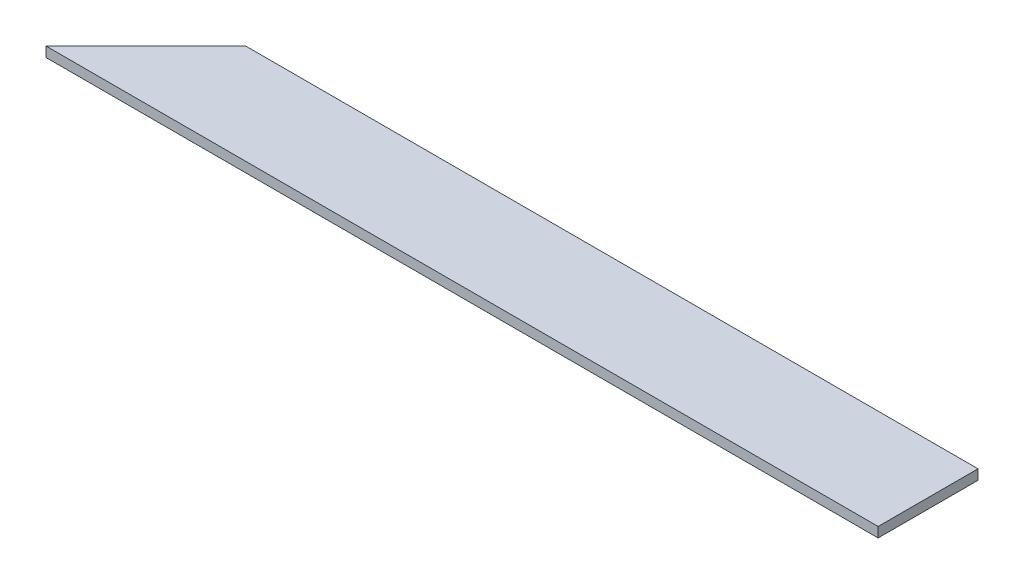
ISO-10303-21;
HEADER;
FILE_DESCRIPTION(('STEP AP214'),'2;1');
FILE_NAME('part.step','',(''),(''),'','','');
FILE_SCHEMA(('AUTOMOTIVE_DESIGN { 1 0 10303 214 1 1 1 1 }'));
ENDSEC;
DATA;
#1=APPLICATION_CONTEXT('core data for automotive mechanical design processes');
#2=APPLICATION_PROTOCOL_DEFINITION('international standard','automotive_design',2000,#1);
#3=PRODUCT_CONTEXT('',#1,'mechanical');
#4=PRODUCT('Part','Part','',(#3));
#5=PRODUCT_RELATED_PRODUCT_CATEGORY('part','',(#4));
#6=PRODUCT_DEFINITION_FORMATION('','',#4);
#7=PRODUCT_DEFINITION_CONTEXT('part definition',#1,'design');
#8=PRODUCT_DEFINITION('design','',#6,#7);
#9=PRODUCT_DEFINITION_SHAPE('','',#8);
#10=(LENGTH_UNIT() NAMED_UNIT(*) SI_UNIT(.MILLI.,.METRE.));
#11=(NAMED_UNIT(*) PLANE_ANGLE_UNIT() SI_UNIT($,.RADIAN.));
#12=(NAMED_UNIT(*) SI_UNIT($,.STERADIAN.) SOLID_ANGLE_UNIT());
#13=UNCERTAINTY_MEASURE_WITH_UNIT(LENGTH_MEASURE(1.E-05),#10,'distance_accuracy_value','');
#14=(GEOMETRIC_REPRESENTATION_CONTEXT(3) GLOBAL_UNCERTAINTY_ASSIGNED_CONTEXT((#13)) GLOBAL_UNIT_ASSIGNED_CONTEXT((#10,
#11,#12)) REPRESENTATION_CONTEXT('',''));
#15=CARTESIAN_POINT('',(0.,0.,0.));
#16=DIRECTION('',(0.,0.,1.));
#17=DIRECTION('',(1.,0.,0.));
#18=AXIS2_PLACEMENT_3D('',#15,#16,#17);
#19=CARTESIAN_POINT('',(125.,3.,-15.));
#20=DIRECTION('',(-1.,0.,0.));
#21=DIRECTION('',(0.,0.,1.));
#22=AXIS2_PLACEMENT_3D('',#19,#20,#21);
#23=PLANE('',#22);
#24=DIRECTION('',(0.,0.,-1.));
#25=VECTOR('',#24,1.);
#26=CARTESIAN_POINT('',(125.,0.,-15.));
#27=LINE('',#26,#25);
#28=CARTESIAN_POINT('',(125.,0.,15.));
#29=VERTEX_POINT('',#28);
#30=CARTESIAN_POINT('',(125.,0.,-15.));
#31=VERTEX_POINT('',#30);
#32=EDGE_CURVE('E96',#29,#31,#27,.T.);
#33=ORIENTED_EDGE('',*,*,#32,.T.);
#34=DIRECTION('',(0.,-1.,0.));
#35=VECTOR('',#34,1.);
#36=CARTESIAN_POINT('',(125.,3.,-15.));
#37=LINE('',#36,#35);
#38=CARTESIAN_POINT('',(125.,3.,-15.));
#39=VERTEX_POINT('',#38);
#40=EDGE_CURVE('E11',#39,#31,#37,.T.);
#41=ORIENTED_EDGE('',*,*,#40,.F.);
#42=DIRECTION('',(0.,0.,-1.));
#43=VECTOR('',#42,1.);
#44=CARTESIAN_POINT('',(125.,3.,-15.));
#45=LINE('',#44,#43);
#46=CARTESIAN_POINT('',(125.,3.,15.));
#47=VERTEX_POINT('',#46);
#48=EDGE_CURVE('E84',#47,#39,#45,.T.);
#49=ORIENTED_EDGE('',*,*,#48,.F.);
#50=DIRECTION('',(0.,-1.,0.));
#51=VECTOR('',#50,1.);
#52=CARTESIAN_POINT('',(125.,3.,15.));
#53=LINE('',#52,#51);
#54=EDGE_CURVE('E92',#47,#29,#53,.T.);
#55=ORIENTED_EDGE('',*,*,#54,.T.);
#56=EDGE_LOOP('',(#33,#41,#49,#55));
#57=FACE_BOUND('',#56,.T.);
#58=ADVANCED_FACE('F33',(#57),#23,.F.);
#59=CARTESIAN_POINT('',(125.,3.,-15.));
#60=DIRECTION('',(0.,0.,1.));
#61=DIRECTION('',(1.,0.,0.));
#62=AXIS2_PLACEMENT_3D('',#59,#60,#61);
#63=PLANE('',#62);
#64=DIRECTION('',(-1.,0.,0.));
#65=VECTOR('',#64,1.);
#66=CARTESIAN_POINT('',(125.,0.,-15.));
#67=LINE('',#66,#65);
#68=CARTESIAN_POINT('',(-95.0000000000004,0.,-15.));
#69=VERTEX_POINT('',#68);
#70=EDGE_CURVE('E88',#31,#69,#67,.T.);
#71=ORIENTED_EDGE('',*,*,#70,.T.);
#72=DIRECTION('',(0.,-1.,0.));
#73=VECTOR('',#72,1.);
#74=CARTESIAN_POINT('',(-95.0000000000004,3.,-15.));
#75=LINE('',#74,#73);
#76=CARTESIAN_POINT('',(-95.0000000000004,3.,-15.));
#77=VERTEX_POINT('',#76);
#78=EDGE_CURVE('E41',#77,#69,#75,.T.);
#79=ORIENTED_EDGE('',*,*,#78,.F.);
#80=DIRECTION('',(-1.,0.,0.));
#81=VECTOR('',#80,1.);
#82=CARTESIAN_POINT('',(125.,3.,-15.));
#83=LINE('',#82,#81);
#84=EDGE_CURVE('E79',#39,#77,#83,.T.);
#85=ORIENTED_EDGE('',*,*,#84,.F.);
#86=ORIENTED_EDGE('',*,*,#40,.T.);
#87=EDGE_LOOP('',(#71,#79,#85,#86));
#88=FACE_BOUND('',#87,.T.);
#89=ADVANCED_FACE('F87',(#88),#63,.F.);
#90=CARTESIAN_POINT('',(-125.,3.,15.));
#91=DIRECTION('',(0.707106781186552,0.,0.707106781186543));
#92=DIRECTION('',(0.707106781186543,0.,-0.707106781186552));
#93=AXIS2_PLACEMENT_3D('',#90,#91,#92);
#94=PLANE('',#93);
#95=DIRECTION('',(-0.707106781186543,0.,0.707106781186552));
#96=VECTOR('',#95,1.);
#97=CARTESIAN_POINT('',(-125.,0.,15.));
#98=LINE('',#97,#96);
#99=CARTESIAN_POINT('',(-125.,0.,15.));
#100=VERTEX_POINT('',#99);
#101=EDGE_CURVE('E66',#69,#100,#98,.T.);
#102=ORIENTED_EDGE('',*,*,#101,.T.);
#103=DIRECTION('',(0.,-1.,0.));
#104=VECTOR('',#103,1.);
#105=CARTESIAN_POINT('',(-125.,3.,15.));
#106=LINE('',#105,#104);
#107=CARTESIAN_POINT('',(-125.,3.,15.));
#108=VERTEX_POINT('',#107);
#109=EDGE_CURVE('E89',#108,#100,#106,.T.);
#110=ORIENTED_EDGE('',*,*,#109,.F.);
#111=DIRECTION('',(-0.707106781186543,0.,0.707106781186552));
#112=VECTOR('',#111,1.);
#113=CARTESIAN_POINT('',(-125.,3.,15.));
#114=LINE('',#113,#112);
#115=EDGE_CURVE('E82',#77,#108,#114,.T.);
#116=ORIENTED_EDGE('',*,*,#115,.F.);
#117=ORIENTED_EDGE('',*,*,#78,.T.);
#118=EDGE_LOOP('',(#102,#110,#116,#117));
#119=FACE_BOUND('',#118,.T.);
#120=ADVANCED_FACE('F90',(#119),#94,.F.);
#121=CARTESIAN_POINT('',(-125.,3.,15.));
#122=DIRECTION('',(0.,0.,-1.));
#123=DIRECTION('',(-1.,0.,0.));
#124=AXIS2_PLACEMENT_3D('',#121,#122,#123);
#125=PLANE('',#124);
#126=DIRECTION('',(1.,0.,0.));
#127=VECTOR('',#126,1.);
#128=CARTESIAN_POINT('',(-125.,0.,15.));
#129=LINE('',#128,#127);
#130=EDGE_CURVE('E72',#100,#29,#129,.T.);
#131=ORIENTED_EDGE('',*,*,#130,.T.);
#132=ORIENTED_EDGE('',*,*,#54,.F.);
#133=DIRECTION('',(1.,0.,0.));
#134=VECTOR('',#133,1.);
#135=CARTESIAN_POINT('',(-125.,3.,15.));
#136=LINE('',#135,#134);
#137=EDGE_CURVE('E49',#108,#47,#136,.T.);
#138=ORIENTED_EDGE('',*,*,#137,.F.);
#139=ORIENTED_EDGE('',*,*,#109,.T.);
#140=EDGE_LOOP('',(#131,#132,#138,#139));
#141=FACE_BOUND('',#140,.T.);
#142=ADVANCED_FACE('F103',(#141),#125,.F.);
#143=CARTESIAN_POINT('',(0.,3.,0.));
#144=DIRECTION('',(0.,1.,0.));
#145=DIRECTION('',(0.,0.,1.));
#146=AXIS2_PLACEMENT_3D('',#143,#144,#145);
#147=PLANE('',#146);
#148=ORIENTED_EDGE('',*,*,#48,.T.);
#149=ORIENTED_EDGE('',*,*,#84,.T.);
#150=ORIENTED_EDGE('',*,*,#115,.T.);
#151=ORIENTED_EDGE('',*,*,#137,.T.);
#152=EDGE_LOOP('',(#148,#149,#150,#151));
#153=FACE_BOUND('',#152,.T.);
#154=ADVANCED_FACE('F80',(#153),#147,.T.);
#155=CARTESIAN_POINT('',(0.,0.,0.));
#156=DIRECTION('',(0.,1.,0.));
#157=DIRECTION('',(0.,0.,1.));
#158=AXIS2_PLACEMENT_3D('',#155,#156,#157);
#159=PLANE('',#158);
#160=ORIENTED_EDGE('',*,*,#32,.F.);
#161=ORIENTED_EDGE('',*,*,#130,.F.);
#162=ORIENTED_EDGE('',*,*,#101,.F.);
#163=ORIENTED_EDGE('',*,*,#70,.F.);
#164=EDGE_LOOP('',(#160,#161,#162,#163));
#165=FACE_BOUND('',#164,.T.);
#166=ADVANCED_FACE('F106',(#165),#159,.F.);
#167=CLOSED_SHELL('',(#58,#89,#120,#142,#154,#166));
#168=MANIFOLD_SOLID_BREP('B2',#167);
#169=ADVANCED_BREP_SHAPE_REPRESENTATION('',(#18,#168),#14);
#170=SHAPE_DEFINITION_REPRESENTATION(#9,#169);
ENDSEC;
END-ISO-10303-21;
